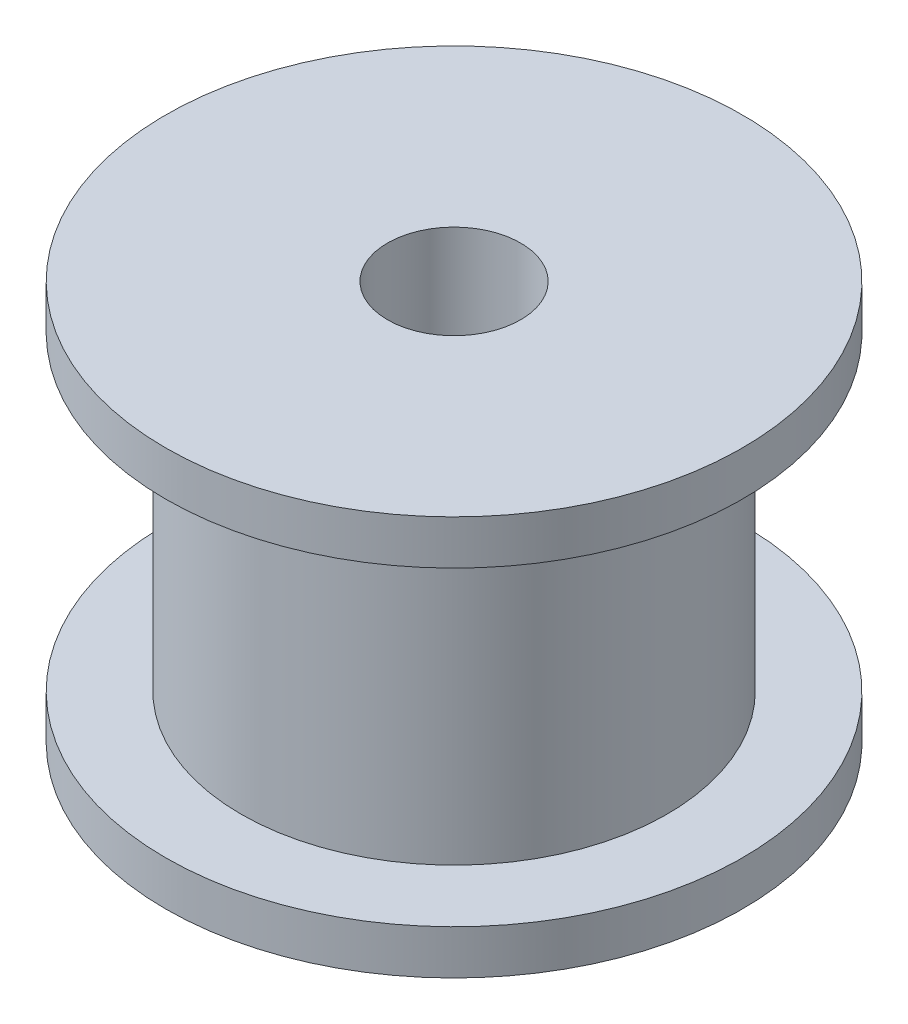
ISO-10303-21;
HEADER;
FILE_DESCRIPTION(('STEP AP214'),'2;1');
FILE_NAME('part.step','',(''),(''),'','','');
FILE_SCHEMA(('AUTOMOTIVE_DESIGN { 1 0 10303 214 1 1 1 1 }'));
ENDSEC;
DATA;
#1=APPLICATION_CONTEXT('core data for automotive mechanical design processes');
#2=APPLICATION_PROTOCOL_DEFINITION('international standard','automotive_design',2000,#1);
#3=PRODUCT_CONTEXT('',#1,'mechanical');
#4=PRODUCT('Part','Part','',(#3));
#5=PRODUCT_RELATED_PRODUCT_CATEGORY('part','',(#4));
#6=PRODUCT_DEFINITION_FORMATION('','',#4);
#7=PRODUCT_DEFINITION_CONTEXT('part definition',#1,'design');
#8=PRODUCT_DEFINITION('design','',#6,#7);
#9=PRODUCT_DEFINITION_SHAPE('','',#8);
#10=(LENGTH_UNIT() NAMED_UNIT(*) SI_UNIT(.MILLI.,.METRE.));
#11=(NAMED_UNIT(*) PLANE_ANGLE_UNIT() SI_UNIT($,.RADIAN.));
#12=(NAMED_UNIT(*) SI_UNIT($,.STERADIAN.) SOLID_ANGLE_UNIT());
#13=UNCERTAINTY_MEASURE_WITH_UNIT(LENGTH_MEASURE(1.E-05),#10,'distance_accuracy_value','');
#14=(GEOMETRIC_REPRESENTATION_CONTEXT(3) GLOBAL_UNCERTAINTY_ASSIGNED_CONTEXT((#13)) GLOBAL_UNIT_ASSIGNED_CONTEXT((#10,
#11,#12)) REPRESENTATION_CONTEXT('',''));
#15=CARTESIAN_POINT('',(0.,0.,0.));
#16=DIRECTION('',(0.,0.,1.));
#17=DIRECTION('',(1.,0.,0.));
#18=AXIS2_PLACEMENT_3D('',#15,#16,#17);
#19=CARTESIAN_POINT('',(0.,1.,0.));
#20=DIRECTION('',(0.,1.,0.));
#21=DIRECTION('',(0.,0.,1.));
#22=AXIS2_PLACEMENT_3D('',#19,#20,#21);
#23=PLANE('',#22);
#24=CARTESIAN_POINT('',(0.,1.,0.));
#25=DIRECTION('',(0.,1.,0.));
#26=DIRECTION('',(0.,0.,1.));
#27=AXIS2_PLACEMENT_3D('',#24,#25,#26);
#28=CIRCLE('',#27,4.8);
#29=CARTESIAN_POINT('',(0.,1.,4.8));
#30=VERTEX_POINT('',#29);
#31=EDGE_CURVE('E10',#30,#30,#28,.T.);
#32=ORIENTED_EDGE('',*,*,#31,.F.);
#33=EDGE_LOOP('',(#32));
#34=FACE_BOUND('',#33,.T.);
#35=CARTESIAN_POINT('',(0.,1.,0.));
#36=DIRECTION('',(0.,1.,0.));
#37=DIRECTION('',(0.,0.,1.));
#38=AXIS2_PLACEMENT_3D('',#35,#36,#37);
#39=CIRCLE('',#38,6.5);
#40=CARTESIAN_POINT('',(0.,1.,6.5));
#41=VERTEX_POINT('',#40);
#42=EDGE_CURVE('E50',#41,#41,#39,.T.);
#43=ORIENTED_EDGE('',*,*,#42,.T.);
#44=EDGE_LOOP('',(#43));
#45=FACE_BOUND('',#44,.T.);
#46=ADVANCED_FACE('F41',(#34,#45),#23,.T.);
#47=CARTESIAN_POINT('',(0.,0.,0.));
#48=DIRECTION('',(0.,1.,0.));
#49=DIRECTION('',(0.,0.,1.));
#50=AXIS2_PLACEMENT_3D('',#47,#48,#49);
#51=PLANE('',#50);
#52=CARTESIAN_POINT('',(0.,0.,0.));
#53=DIRECTION('',(0.,1.,0.));
#54=DIRECTION('',(0.,0.,1.));
#55=AXIS2_PLACEMENT_3D('',#52,#53,#54);
#56=CIRCLE('',#55,6.5);
#57=CARTESIAN_POINT('',(0.,0.,6.5));
#58=VERTEX_POINT('',#57);
#59=EDGE_CURVE('E45',#58,#58,#56,.T.);
#60=ORIENTED_EDGE('',*,*,#59,.F.);
#61=EDGE_LOOP('',(#60));
#62=FACE_BOUND('',#61,.T.);
#63=CARTESIAN_POINT('',(0.,0.,0.));
#64=DIRECTION('',(0.,1.,0.));
#65=DIRECTION('',(0.,0.,1.));
#66=AXIS2_PLACEMENT_3D('',#63,#64,#65);
#67=CIRCLE('',#66,1.5);
#68=CARTESIAN_POINT('',(0.,0.,1.5));
#69=VERTEX_POINT('',#68);
#70=EDGE_CURVE('E60',#69,#69,#67,.T.);
#71=ORIENTED_EDGE('',*,*,#70,.T.);
#72=EDGE_LOOP('',(#71));
#73=FACE_BOUND('',#72,.T.);
#74=ADVANCED_FACE('F102',(#62,#73),#51,.F.);
#75=CARTESIAN_POINT('',(0.,1.,0.));
#76=DIRECTION('',(0.,-1.,0.));
#77=DIRECTION('',(0.,0.,-1.));
#78=AXIS2_PLACEMENT_3D('',#75,#76,#77);
#79=CYLINDRICAL_SURFACE('',#78,6.5);
#80=ORIENTED_EDGE('',*,*,#42,.F.);
#81=EDGE_LOOP('',(#80));
#82=FACE_BOUND('',#81,.T.);
#83=ORIENTED_EDGE('',*,*,#59,.T.);
#84=EDGE_LOOP('',(#83));
#85=FACE_BOUND('',#84,.T.);
#86=ADVANCED_FACE('F43',(#82,#85),#79,.T.);
#87=CARTESIAN_POINT('',(0.,1.,0.));
#88=DIRECTION('',(0.,-1.,0.));
#89=DIRECTION('',(0.,0.,-1.));
#90=AXIS2_PLACEMENT_3D('',#87,#88,#89);
#91=CYLINDRICAL_SURFACE('',#90,1.5);
#92=ORIENTED_EDGE('',*,*,#70,.F.);
#93=EDGE_LOOP('',(#92));
#94=FACE_BOUND('',#93,.T.);
#95=CARTESIAN_POINT('',(0.,9.,0.));
#96=DIRECTION('',(0.,1.,0.));
#97=DIRECTION('',(0.,0.,1.));
#98=AXIS2_PLACEMENT_3D('',#95,#96,#97);
#99=CIRCLE('',#98,1.5);
#100=CARTESIAN_POINT('',(0.,9.,1.5));
#101=VERTEX_POINT('',#100);
#102=EDGE_CURVE('E80',#101,#101,#99,.T.);
#103=ORIENTED_EDGE('',*,*,#102,.T.);
#104=EDGE_LOOP('',(#103));
#105=FACE_BOUND('',#104,.T.);
#106=ADVANCED_FACE('F86',(#94,#105),#91,.F.);
#107=CARTESIAN_POINT('',(0.,8.,0.));
#108=DIRECTION('',(0.,-1.,0.));
#109=DIRECTION('',(0.,0.,-1.));
#110=AXIS2_PLACEMENT_3D('',#107,#108,#109);
#111=CYLINDRICAL_SURFACE('',#110,4.8);
#112=CARTESIAN_POINT('',(0.,8.,0.));
#113=DIRECTION('',(0.,1.,0.));
#114=DIRECTION('',(0.,0.,1.));
#115=AXIS2_PLACEMENT_3D('',#112,#113,#114);
#116=CIRCLE('',#115,4.8);
#117=CARTESIAN_POINT('',(0.,8.,4.8));
#118=VERTEX_POINT('',#117);
#119=EDGE_CURVE('E58',#118,#118,#116,.T.);
#120=ORIENTED_EDGE('',*,*,#119,.F.);
#121=EDGE_LOOP('',(#120));
#122=FACE_BOUND('',#121,.T.);
#123=ORIENTED_EDGE('',*,*,#31,.T.);
#124=EDGE_LOOP('',(#123));
#125=FACE_BOUND('',#124,.T.);
#126=ADVANCED_FACE('F91',(#122,#125),#111,.T.);
#127=CARTESIAN_POINT('',(0.,9.,0.));
#128=DIRECTION('',(0.,1.,0.));
#129=DIRECTION('',(0.,0.,1.));
#130=AXIS2_PLACEMENT_3D('',#127,#128,#129);
#131=PLANE('',#130);
#132=CARTESIAN_POINT('',(0.,9.,0.));
#133=DIRECTION('',(0.,1.,0.));
#134=DIRECTION('',(0.,0.,1.));
#135=AXIS2_PLACEMENT_3D('',#132,#133,#134);
#136=CIRCLE('',#135,6.5);
#137=CARTESIAN_POINT('',(0.,9.,6.5));
#138=VERTEX_POINT('',#137);
#139=EDGE_CURVE('E69',#138,#138,#136,.T.);
#140=ORIENTED_EDGE('',*,*,#139,.T.);
#141=EDGE_LOOP('',(#140));
#142=FACE_BOUND('',#141,.T.);
#143=ORIENTED_EDGE('',*,*,#102,.F.);
#144=EDGE_LOOP('',(#143));
#145=FACE_BOUND('',#144,.T.);
#146=ADVANCED_FACE('F88',(#142,#145),#131,.T.);
#147=CARTESIAN_POINT('',(0.,8.,0.));
#148=DIRECTION('',(0.,1.,0.));
#149=DIRECTION('',(0.,0.,1.));
#150=AXIS2_PLACEMENT_3D('',#147,#148,#149);
#151=PLANE('',#150);
#152=ORIENTED_EDGE('',*,*,#119,.T.);
#153=EDGE_LOOP('',(#152));
#154=FACE_BOUND('',#153,.T.);
#155=CARTESIAN_POINT('',(0.,8.,0.));
#156=DIRECTION('',(0.,1.,0.));
#157=DIRECTION('',(0.,0.,1.));
#158=AXIS2_PLACEMENT_3D('',#155,#156,#157);
#159=CIRCLE('',#158,6.5);
#160=CARTESIAN_POINT('',(0.,8.,6.5));
#161=VERTEX_POINT('',#160);
#162=EDGE_CURVE('E74',#161,#161,#159,.T.);
#163=ORIENTED_EDGE('',*,*,#162,.F.);
#164=EDGE_LOOP('',(#163));
#165=FACE_BOUND('',#164,.T.);
#166=ADVANCED_FACE('F90',(#154,#165),#151,.F.);
#167=CARTESIAN_POINT('',(0.,9.,0.));
#168=DIRECTION('',(0.,-1.,0.));
#169=DIRECTION('',(0.,0.,-1.));
#170=AXIS2_PLACEMENT_3D('',#167,#168,#169);
#171=CYLINDRICAL_SURFACE('',#170,6.5);
#172=ORIENTED_EDGE('',*,*,#139,.F.);
#173=EDGE_LOOP('',(#172));
#174=FACE_BOUND('',#173,.T.);
#175=ORIENTED_EDGE('',*,*,#162,.T.);
#176=EDGE_LOOP('',(#175));
#177=FACE_BOUND('',#176,.T.);
#178=ADVANCED_FACE('F97',(#174,#177),#171,.T.);
#179=CLOSED_SHELL('',(#46,#74,#86,#106,#126,#146,#166,#178));
#180=MANIFOLD_SOLID_BREP('B2',#179);
#181=ADVANCED_BREP_SHAPE_REPRESENTATION('',(#18,#180),#14);
#182=SHAPE_DEFINITION_REPRESENTATION(#9,#181);
ENDSEC;
END-ISO-10303-21;
